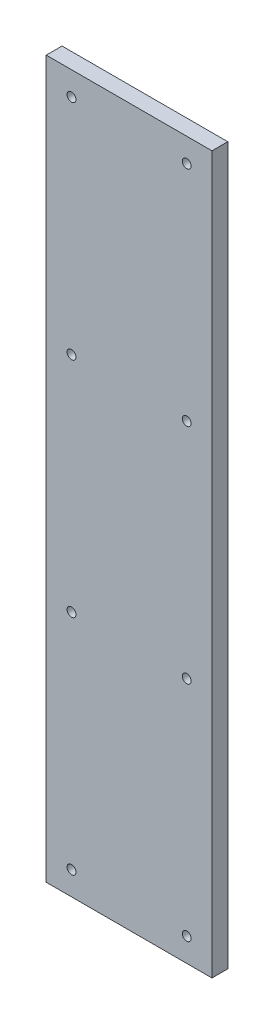
ISO-10303-21;
HEADER;
FILE_DESCRIPTION(('STEP AP214'),'2;1');
FILE_NAME('part.step','',(''),(''),'','','');
FILE_SCHEMA(('AUTOMOTIVE_DESIGN { 1 0 10303 214 1 1 1 1 }'));
ENDSEC;
DATA;
#1=APPLICATION_CONTEXT('core data for automotive mechanical design processes');
#2=APPLICATION_PROTOCOL_DEFINITION('international standard','automotive_design',2000,#1);
#3=PRODUCT_CONTEXT('',#1,'mechanical');
#4=PRODUCT('Part','Part','',(#3));
#5=PRODUCT_RELATED_PRODUCT_CATEGORY('part','',(#4));
#6=PRODUCT_DEFINITION_FORMATION('','',#4);
#7=PRODUCT_DEFINITION_CONTEXT('part definition',#1,'design');
#8=PRODUCT_DEFINITION('design','',#6,#7);
#9=PRODUCT_DEFINITION_SHAPE('','',#8);
#10=(LENGTH_UNIT() NAMED_UNIT(*) SI_UNIT(.MILLI.,.METRE.));
#11=(NAMED_UNIT(*) PLANE_ANGLE_UNIT() SI_UNIT($,.RADIAN.));
#12=(NAMED_UNIT(*) SI_UNIT($,.STERADIAN.) SOLID_ANGLE_UNIT());
#13=UNCERTAINTY_MEASURE_WITH_UNIT(LENGTH_MEASURE(1.E-05),#10,'distance_accuracy_value','');
#14=(GEOMETRIC_REPRESENTATION_CONTEXT(3) GLOBAL_UNCERTAINTY_ASSIGNED_CONTEXT((#13)) GLOBAL_UNIT_ASSIGNED_CONTEXT((#10,
#11,#12)) REPRESENTATION_CONTEXT('',''));
#15=CARTESIAN_POINT('',(0.,0.,0.));
#16=DIRECTION('',(0.,0.,1.));
#17=DIRECTION('',(1.,0.,0.));
#18=AXIS2_PLACEMENT_3D('',#15,#16,#17);
#19=CARTESIAN_POINT('',(0.,0.,6.35));
#20=DIRECTION('',(0.,0.,1.));
#21=DIRECTION('',(1.,0.,0.));
#22=AXIS2_PLACEMENT_3D('',#19,#20,#21);
#23=PLANE('',#22);
#24=CARTESIAN_POINT('',(10.175,-189.018333333333,6.35));
#25=DIRECTION('',(0.,0.,1.));
#26=DIRECTION('',(1.,0.,0.));
#27=AXIS2_PLACEMENT_3D('',#24,#25,#26);
#28=CIRCLE('',#27,1.7859375);
#29=CARTESIAN_POINT('',(11.9609375,-189.018333333333,6.35));
#30=VERTEX_POINT('',#29);
#31=EDGE_CURVE('E174',#30,#30,#28,.T.);
#32=ORIENTED_EDGE('',*,*,#31,.F.);
#33=EDGE_LOOP('',(#32));
#34=FACE_BOUND('',#33,.T.);
#35=CARTESIAN_POINT('',(10.175,-278.765,6.35));
#36=DIRECTION('',(0.,0.,1.));
#37=DIRECTION('',(1.,0.,0.));
#38=AXIS2_PLACEMENT_3D('',#35,#36,#37);
#39=CIRCLE('',#38,1.78593749999999);
#40=CARTESIAN_POINT('',(11.9609375,-278.765,6.35));
#41=VERTEX_POINT('',#40);
#42=EDGE_CURVE('E158',#41,#41,#39,.T.);
#43=ORIENTED_EDGE('',*,*,#42,.F.);
#44=EDGE_LOOP('',(#43));
#45=FACE_BOUND('',#44,.T.);
#46=CARTESIAN_POINT('',(56.525,-99.2716666666667,6.35));
#47=DIRECTION('',(0.,0.,1.));
#48=DIRECTION('',(1.,0.,0.));
#49=AXIS2_PLACEMENT_3D('',#46,#47,#48);
#50=CIRCLE('',#49,1.78593750000001);
#51=CARTESIAN_POINT('',(58.3109375,-99.2716666666667,6.35));
#52=VERTEX_POINT('',#51);
#53=EDGE_CURVE('E142',#52,#52,#50,.T.);
#54=ORIENTED_EDGE('',*,*,#53,.F.);
#55=EDGE_LOOP('',(#54));
#56=FACE_BOUND('',#55,.T.);
#57=CARTESIAN_POINT('',(10.175,-9.52500000000001,6.35));
#58=DIRECTION('',(0.,0.,1.));
#59=DIRECTION('',(1.,0.,0.));
#60=AXIS2_PLACEMENT_3D('',#57,#58,#59);
#61=CIRCLE('',#60,1.7859375);
#62=CARTESIAN_POINT('',(11.9609375,-9.52500000000001,6.35));
#63=VERTEX_POINT('',#62);
#64=EDGE_CURVE('E112',#63,#63,#61,.T.);
#65=ORIENTED_EDGE('',*,*,#64,.F.);
#66=EDGE_LOOP('',(#65));
#67=FACE_BOUND('',#66,.T.);
#68=DIRECTION('',(0.,-1.,0.));
#69=VECTOR('',#68,1.);
#70=CARTESIAN_POINT('',(0.,0.,6.35));
#71=LINE('',#70,#69);
#72=CARTESIAN_POINT('',(0.,0.,6.35));
#73=VERTEX_POINT('',#72);
#74=CARTESIAN_POINT('',(0.,-288.29,6.35));
#75=VERTEX_POINT('',#74);
#76=EDGE_CURVE('E92',#73,#75,#71,.T.);
#77=ORIENTED_EDGE('',*,*,#76,.T.);
#78=DIRECTION('',(1.,0.,0.));
#79=VECTOR('',#78,1.);
#80=CARTESIAN_POINT('',(0.,-288.29,6.35));
#81=LINE('',#80,#79);
#82=CARTESIAN_POINT('',(66.7,-288.29,6.35));
#83=VERTEX_POINT('',#82);
#84=EDGE_CURVE('E87',#75,#83,#81,.T.);
#85=ORIENTED_EDGE('',*,*,#84,.T.);
#86=DIRECTION('',(0.,1.,0.));
#87=VECTOR('',#86,1.);
#88=CARTESIAN_POINT('',(66.7,-288.29,6.35));
#89=LINE('',#88,#87);
#90=CARTESIAN_POINT('',(66.7,0.,6.35));
#91=VERTEX_POINT('',#90);
#92=EDGE_CURVE('E90',#83,#91,#89,.T.);
#93=ORIENTED_EDGE('',*,*,#92,.T.);
#94=DIRECTION('',(-1.,0.,0.));
#95=VECTOR('',#94,1.);
#96=CARTESIAN_POINT('',(66.7,0.,6.35));
#97=LINE('',#96,#95);
#98=EDGE_CURVE('E57',#91,#73,#97,.T.);
#99=ORIENTED_EDGE('',*,*,#98,.T.);
#100=EDGE_LOOP('',(#77,#85,#93,#99));
#101=FACE_BOUND('',#100,.T.);
#102=CARTESIAN_POINT('',(56.5249999999999,-9.52500000000001,6.35));
#103=DIRECTION('',(0.,0.,1.));
#104=DIRECTION('',(1.,0.,0.));
#105=AXIS2_PLACEMENT_3D('',#102,#103,#104);
#106=CIRCLE('',#105,1.7859375);
#107=CARTESIAN_POINT('',(58.3109375,-9.52500000000001,6.35));
#108=VERTEX_POINT('',#107);
#109=EDGE_CURVE('E134',#108,#108,#106,.T.);
#110=ORIENTED_EDGE('',*,*,#109,.F.);
#111=EDGE_LOOP('',(#110));
#112=FACE_BOUND('',#111,.T.);
#113=CARTESIAN_POINT('',(10.175,-99.2716666666667,6.35));
#114=DIRECTION('',(0.,0.,1.));
#115=DIRECTION('',(1.,0.,0.));
#116=AXIS2_PLACEMENT_3D('',#113,#114,#115);
#117=CIRCLE('',#116,1.7859375);
#118=CARTESIAN_POINT('',(11.9609375,-99.2716666666667,6.35));
#119=VERTEX_POINT('',#118);
#120=EDGE_CURVE('E150',#119,#119,#117,.T.);
#121=ORIENTED_EDGE('',*,*,#120,.F.);
#122=EDGE_LOOP('',(#121));
#123=FACE_BOUND('',#122,.T.);
#124=CARTESIAN_POINT('',(56.525,-278.765,6.35));
#125=DIRECTION('',(0.,0.,1.));
#126=DIRECTION('',(1.,0.,0.));
#127=AXIS2_PLACEMENT_3D('',#124,#125,#126);
#128=CIRCLE('',#127,1.78593749999999);
#129=CARTESIAN_POINT('',(58.3109375,-278.765,6.35));
#130=VERTEX_POINT('',#129);
#131=EDGE_CURVE('E166',#130,#130,#128,.T.);
#132=ORIENTED_EDGE('',*,*,#131,.F.);
#133=EDGE_LOOP('',(#132));
#134=FACE_BOUND('',#133,.T.);
#135=CARTESIAN_POINT('',(56.525,-189.018333333333,6.35));
#136=DIRECTION('',(0.,0.,1.));
#137=DIRECTION('',(1.,0.,0.));
#138=AXIS2_PLACEMENT_3D('',#135,#136,#137);
#139=CIRCLE('',#138,1.78593750000001);
#140=CARTESIAN_POINT('',(58.3109375,-189.018333333333,6.35));
#141=VERTEX_POINT('',#140);
#142=EDGE_CURVE('E182',#141,#141,#139,.T.);
#143=ORIENTED_EDGE('',*,*,#142,.F.);
#144=EDGE_LOOP('',(#143));
#145=FACE_BOUND('',#144,.T.);
#146=ADVANCED_FACE('F39',(#34,#45,#56,#67,#101,#112,#123,#134,#145),#23,.T.);
#147=CARTESIAN_POINT('',(0.,0.,0.));
#148=DIRECTION('',(0.,0.,1.));
#149=DIRECTION('',(1.,0.,0.));
#150=AXIS2_PLACEMENT_3D('',#147,#148,#149);
#151=PLANE('',#150);
#152=DIRECTION('',(0.,-1.,0.));
#153=VECTOR('',#152,1.);
#154=CARTESIAN_POINT('',(0.,0.,0.));
#155=LINE('',#154,#153);
#156=CARTESIAN_POINT('',(0.,0.,0.));
#157=VERTEX_POINT('',#156);
#158=CARTESIAN_POINT('',(0.,-288.29,0.));
#159=VERTEX_POINT('',#158);
#160=EDGE_CURVE('E108',#157,#159,#155,.T.);
#161=ORIENTED_EDGE('',*,*,#160,.F.);
#162=DIRECTION('',(-1.,0.,0.));
#163=VECTOR('',#162,1.);
#164=CARTESIAN_POINT('',(66.7,0.,0.));
#165=LINE('',#164,#163);
#166=CARTESIAN_POINT('',(66.7,0.,0.));
#167=VERTEX_POINT('',#166);
#168=EDGE_CURVE('E80',#167,#157,#165,.T.);
#169=ORIENTED_EDGE('',*,*,#168,.F.);
#170=DIRECTION('',(0.,1.,0.));
#171=VECTOR('',#170,1.);
#172=CARTESIAN_POINT('',(66.7,-288.29,0.));
#173=LINE('',#172,#171);
#174=CARTESIAN_POINT('',(66.7,-288.29,0.));
#175=VERTEX_POINT('',#174);
#176=EDGE_CURVE('E74',#175,#167,#173,.T.);
#177=ORIENTED_EDGE('',*,*,#176,.F.);
#178=DIRECTION('',(1.,0.,0.));
#179=VECTOR('',#178,1.);
#180=CARTESIAN_POINT('',(0.,-288.29,0.));
#181=LINE('',#180,#179);
#182=EDGE_CURVE('E97',#159,#175,#181,.T.);
#183=ORIENTED_EDGE('',*,*,#182,.F.);
#184=EDGE_LOOP('',(#161,#169,#177,#183));
#185=FACE_BOUND('',#184,.T.);
#186=CARTESIAN_POINT('',(10.175,-9.52500000000001,0.));
#187=DIRECTION('',(0.,0.,1.));
#188=DIRECTION('',(1.,0.,0.));
#189=AXIS2_PLACEMENT_3D('',#186,#187,#188);
#190=CIRCLE('',#189,1.7859375);
#191=CARTESIAN_POINT('',(11.9609375,-9.52500000000001,0.));
#192=VERTEX_POINT('',#191);
#193=EDGE_CURVE('E130',#192,#192,#190,.T.);
#194=ORIENTED_EDGE('',*,*,#193,.T.);
#195=EDGE_LOOP('',(#194));
#196=FACE_BOUND('',#195,.T.);
#197=CARTESIAN_POINT('',(56.5249999999999,-9.52500000000001,0.));
#198=DIRECTION('',(0.,0.,1.));
#199=DIRECTION('',(1.,0.,0.));
#200=AXIS2_PLACEMENT_3D('',#197,#198,#199);
#201=CIRCLE('',#200,1.7859375);
#202=CARTESIAN_POINT('',(58.3109375,-9.52500000000001,0.));
#203=VERTEX_POINT('',#202);
#204=EDGE_CURVE('E138',#203,#203,#201,.T.);
#205=ORIENTED_EDGE('',*,*,#204,.T.);
#206=EDGE_LOOP('',(#205));
#207=FACE_BOUND('',#206,.T.);
#208=CARTESIAN_POINT('',(56.525,-99.2716666666667,0.));
#209=DIRECTION('',(0.,0.,1.));
#210=DIRECTION('',(1.,0.,0.));
#211=AXIS2_PLACEMENT_3D('',#208,#209,#210);
#212=CIRCLE('',#211,1.78593750000001);
#213=CARTESIAN_POINT('',(58.3109375,-99.2716666666667,0.));
#214=VERTEX_POINT('',#213);
#215=EDGE_CURVE('E146',#214,#214,#212,.T.);
#216=ORIENTED_EDGE('',*,*,#215,.T.);
#217=EDGE_LOOP('',(#216));
#218=FACE_BOUND('',#217,.T.);
#219=CARTESIAN_POINT('',(10.175,-99.2716666666667,0.));
#220=DIRECTION('',(0.,0.,1.));
#221=DIRECTION('',(1.,0.,0.));
#222=AXIS2_PLACEMENT_3D('',#219,#220,#221);
#223=CIRCLE('',#222,1.7859375);
#224=CARTESIAN_POINT('',(11.9609375,-99.2716666666667,0.));
#225=VERTEX_POINT('',#224);
#226=EDGE_CURVE('E154',#225,#225,#223,.T.);
#227=ORIENTED_EDGE('',*,*,#226,.T.);
#228=EDGE_LOOP('',(#227));
#229=FACE_BOUND('',#228,.T.);
#230=CARTESIAN_POINT('',(10.175,-278.765,0.));
#231=DIRECTION('',(0.,0.,1.));
#232=DIRECTION('',(1.,0.,0.));
#233=AXIS2_PLACEMENT_3D('',#230,#231,#232);
#234=CIRCLE('',#233,1.78593749999999);
#235=CARTESIAN_POINT('',(11.9609375,-278.765,0.));
#236=VERTEX_POINT('',#235);
#237=EDGE_CURVE('E162',#236,#236,#234,.T.);
#238=ORIENTED_EDGE('',*,*,#237,.T.);
#239=EDGE_LOOP('',(#238));
#240=FACE_BOUND('',#239,.T.);
#241=CARTESIAN_POINT('',(56.525,-278.765,0.));
#242=DIRECTION('',(0.,0.,1.));
#243=DIRECTION('',(1.,0.,0.));
#244=AXIS2_PLACEMENT_3D('',#241,#242,#243);
#245=CIRCLE('',#244,1.78593749999999);
#246=CARTESIAN_POINT('',(58.3109375,-278.765,0.));
#247=VERTEX_POINT('',#246);
#248=EDGE_CURVE('E170',#247,#247,#245,.T.);
#249=ORIENTED_EDGE('',*,*,#248,.T.);
#250=EDGE_LOOP('',(#249));
#251=FACE_BOUND('',#250,.T.);
#252=CARTESIAN_POINT('',(10.175,-189.018333333333,0.));
#253=DIRECTION('',(0.,0.,1.));
#254=DIRECTION('',(1.,0.,0.));
#255=AXIS2_PLACEMENT_3D('',#252,#253,#254);
#256=CIRCLE('',#255,1.7859375);
#257=CARTESIAN_POINT('',(11.9609375,-189.018333333333,0.));
#258=VERTEX_POINT('',#257);
#259=EDGE_CURVE('E178',#258,#258,#256,.T.);
#260=ORIENTED_EDGE('',*,*,#259,.T.);
#261=EDGE_LOOP('',(#260));
#262=FACE_BOUND('',#261,.T.);
#263=CARTESIAN_POINT('',(56.525,-189.018333333333,0.));
#264=DIRECTION('',(0.,0.,1.));
#265=DIRECTION('',(1.,0.,0.));
#266=AXIS2_PLACEMENT_3D('',#263,#264,#265);
#267=CIRCLE('',#266,1.78593750000001);
#268=CARTESIAN_POINT('',(58.3109375,-189.018333333333,0.));
#269=VERTEX_POINT('',#268);
#270=EDGE_CURVE('E186',#269,#269,#267,.T.);
#271=ORIENTED_EDGE('',*,*,#270,.T.);
#272=EDGE_LOOP('',(#271));
#273=FACE_BOUND('',#272,.T.);
#274=ADVANCED_FACE('F125',(#185,#196,#207,#218,#229,#240,#251,#262,#273),#151,.F.);
#275=CARTESIAN_POINT('',(0.,0.,6.35));
#276=DIRECTION('',(1.,0.,0.));
#277=DIRECTION('',(0.,0.,-1.));
#278=AXIS2_PLACEMENT_3D('',#275,#276,#277);
#279=PLANE('',#278);
#280=ORIENTED_EDGE('',*,*,#160,.T.);
#281=DIRECTION('',(0.,0.,-1.));
#282=VECTOR('',#281,1.);
#283=CARTESIAN_POINT('',(0.,-288.29,6.35));
#284=LINE('',#283,#282);
#285=EDGE_CURVE('E11',#75,#159,#284,.T.);
#286=ORIENTED_EDGE('',*,*,#285,.F.);
#287=ORIENTED_EDGE('',*,*,#76,.F.);
#288=DIRECTION('',(0.,0.,-1.));
#289=VECTOR('',#288,1.);
#290=CARTESIAN_POINT('',(0.,0.,6.35));
#291=LINE('',#290,#289);
#292=EDGE_CURVE('E104',#73,#157,#291,.T.);
#293=ORIENTED_EDGE('',*,*,#292,.T.);
#294=EDGE_LOOP('',(#280,#286,#287,#293));
#295=FACE_BOUND('',#294,.T.);
#296=ADVANCED_FACE('F41',(#295),#279,.F.);
#297=CARTESIAN_POINT('',(0.,-288.29,6.35));
#298=DIRECTION('',(0.,1.,0.));
#299=DIRECTION('',(0.,0.,1.));
#300=AXIS2_PLACEMENT_3D('',#297,#298,#299);
#301=PLANE('',#300);
#302=ORIENTED_EDGE('',*,*,#182,.T.);
#303=DIRECTION('',(0.,0.,-1.));
#304=VECTOR('',#303,1.);
#305=CARTESIAN_POINT('',(66.7,-288.29,6.35));
#306=LINE('',#305,#304);
#307=EDGE_CURVE('E49',#83,#175,#306,.T.);
#308=ORIENTED_EDGE('',*,*,#307,.F.);
#309=ORIENTED_EDGE('',*,*,#84,.F.);
#310=ORIENTED_EDGE('',*,*,#285,.T.);
#311=EDGE_LOOP('',(#302,#308,#309,#310));
#312=FACE_BOUND('',#311,.T.);
#313=ADVANCED_FACE('F96',(#312),#301,.F.);
#314=CARTESIAN_POINT('',(66.7,-288.29,6.35));
#315=DIRECTION('',(-1.,0.,0.));
#316=DIRECTION('',(0.,0.,1.));
#317=AXIS2_PLACEMENT_3D('',#314,#315,#316);
#318=PLANE('',#317);
#319=ORIENTED_EDGE('',*,*,#176,.T.);
#320=DIRECTION('',(0.,0.,-1.));
#321=VECTOR('',#320,1.);
#322=CARTESIAN_POINT('',(66.7,0.,6.35));
#323=LINE('',#322,#321);
#324=EDGE_CURVE('E99',#91,#167,#323,.T.);
#325=ORIENTED_EDGE('',*,*,#324,.F.);
#326=ORIENTED_EDGE('',*,*,#92,.F.);
#327=ORIENTED_EDGE('',*,*,#307,.T.);
#328=EDGE_LOOP('',(#319,#325,#326,#327));
#329=FACE_BOUND('',#328,.T.);
#330=ADVANCED_FACE('F100',(#329),#318,.F.);
#331=CARTESIAN_POINT('',(66.7,0.,6.35));
#332=DIRECTION('',(0.,-1.,0.));
#333=DIRECTION('',(0.,0.,-1.));
#334=AXIS2_PLACEMENT_3D('',#331,#332,#333);
#335=PLANE('',#334);
#336=ORIENTED_EDGE('',*,*,#168,.T.);
#337=ORIENTED_EDGE('',*,*,#292,.F.);
#338=ORIENTED_EDGE('',*,*,#98,.F.);
#339=ORIENTED_EDGE('',*,*,#324,.T.);
#340=EDGE_LOOP('',(#336,#337,#338,#339));
#341=FACE_BOUND('',#340,.T.);
#342=ADVANCED_FACE('F122',(#341),#335,.F.);
#343=CARTESIAN_POINT('',(10.175,-9.52500000000001,6.35));
#344=DIRECTION('',(0.,0.,-1.));
#345=DIRECTION('',(-1.,0.,0.));
#346=AXIS2_PLACEMENT_3D('',#343,#344,#345);
#347=CYLINDRICAL_SURFACE('',#346,1.7859375);
#348=ORIENTED_EDGE('',*,*,#64,.T.);
#349=EDGE_LOOP('',(#348));
#350=FACE_BOUND('',#349,.T.);
#351=ORIENTED_EDGE('',*,*,#193,.F.);
#352=EDGE_LOOP('',(#351));
#353=FACE_BOUND('',#352,.T.);
#354=ADVANCED_FACE('F207',(#350,#353),#347,.F.);
#355=CARTESIAN_POINT('',(56.5249999999999,-9.52500000000001,6.35));
#356=DIRECTION('',(0.,0.,-1.));
#357=DIRECTION('',(-1.,0.,0.));
#358=AXIS2_PLACEMENT_3D('',#355,#356,#357);
#359=CYLINDRICAL_SURFACE('',#358,1.7859375);
#360=ORIENTED_EDGE('',*,*,#109,.T.);
#361=EDGE_LOOP('',(#360));
#362=FACE_BOUND('',#361,.T.);
#363=ORIENTED_EDGE('',*,*,#204,.F.);
#364=EDGE_LOOP('',(#363));
#365=FACE_BOUND('',#364,.T.);
#366=ADVANCED_FACE('F253',(#362,#365),#359,.F.);
#367=CARTESIAN_POINT('',(56.525,-99.2716666666667,6.35));
#368=DIRECTION('',(0.,0.,-1.));
#369=DIRECTION('',(-1.,0.,0.));
#370=AXIS2_PLACEMENT_3D('',#367,#368,#369);
#371=CYLINDRICAL_SURFACE('',#370,1.78593750000001);
#372=ORIENTED_EDGE('',*,*,#53,.T.);
#373=EDGE_LOOP('',(#372));
#374=FACE_BOUND('',#373,.T.);
#375=ORIENTED_EDGE('',*,*,#215,.F.);
#376=EDGE_LOOP('',(#375));
#377=FACE_BOUND('',#376,.T.);
#378=ADVANCED_FACE('F261',(#374,#377),#371,.F.);
#379=CARTESIAN_POINT('',(10.175,-99.2716666666667,6.35));
#380=DIRECTION('',(0.,0.,-1.));
#381=DIRECTION('',(-1.,0.,0.));
#382=AXIS2_PLACEMENT_3D('',#379,#380,#381);
#383=CYLINDRICAL_SURFACE('',#382,1.7859375);
#384=ORIENTED_EDGE('',*,*,#120,.T.);
#385=EDGE_LOOP('',(#384));
#386=FACE_BOUND('',#385,.T.);
#387=ORIENTED_EDGE('',*,*,#226,.F.);
#388=EDGE_LOOP('',(#387));
#389=FACE_BOUND('',#388,.T.);
#390=ADVANCED_FACE('F269',(#386,#389),#383,.F.);
#391=CARTESIAN_POINT('',(10.175,-278.765,6.35));
#392=DIRECTION('',(0.,0.,-1.));
#393=DIRECTION('',(-1.,0.,0.));
#394=AXIS2_PLACEMENT_3D('',#391,#392,#393);
#395=CYLINDRICAL_SURFACE('',#394,1.78593749999999);
#396=ORIENTED_EDGE('',*,*,#42,.T.);
#397=EDGE_LOOP('',(#396));
#398=FACE_BOUND('',#397,.T.);
#399=ORIENTED_EDGE('',*,*,#237,.F.);
#400=EDGE_LOOP('',(#399));
#401=FACE_BOUND('',#400,.T.);
#402=ADVANCED_FACE('F278',(#398,#401),#395,.F.);
#403=CARTESIAN_POINT('',(56.525,-278.765,6.35));
#404=DIRECTION('',(0.,0.,-1.));
#405=DIRECTION('',(-1.,0.,0.));
#406=AXIS2_PLACEMENT_3D('',#403,#404,#405);
#407=CYLINDRICAL_SURFACE('',#406,1.78593749999999);
#408=ORIENTED_EDGE('',*,*,#131,.T.);
#409=EDGE_LOOP('',(#408));
#410=FACE_BOUND('',#409,.T.);
#411=ORIENTED_EDGE('',*,*,#248,.F.);
#412=EDGE_LOOP('',(#411));
#413=FACE_BOUND('',#412,.T.);
#414=ADVANCED_FACE('F287',(#410,#413),#407,.F.);
#415=CARTESIAN_POINT('',(10.175,-189.018333333333,6.35));
#416=DIRECTION('',(0.,0.,-1.));
#417=DIRECTION('',(-1.,0.,0.));
#418=AXIS2_PLACEMENT_3D('',#415,#416,#417);
#419=CYLINDRICAL_SURFACE('',#418,1.7859375);
#420=ORIENTED_EDGE('',*,*,#31,.T.);
#421=EDGE_LOOP('',(#420));
#422=FACE_BOUND('',#421,.T.);
#423=ORIENTED_EDGE('',*,*,#259,.F.);
#424=EDGE_LOOP('',(#423));
#425=FACE_BOUND('',#424,.T.);
#426=ADVANCED_FACE('F296',(#422,#425),#419,.F.);
#427=CARTESIAN_POINT('',(56.525,-189.018333333333,6.35));
#428=DIRECTION('',(0.,0.,-1.));
#429=DIRECTION('',(-1.,0.,0.));
#430=AXIS2_PLACEMENT_3D('',#427,#428,#429);
#431=CYLINDRICAL_SURFACE('',#430,1.78593750000001);
#432=ORIENTED_EDGE('',*,*,#142,.T.);
#433=EDGE_LOOP('',(#432));
#434=FACE_BOUND('',#433,.T.);
#435=ORIENTED_EDGE('',*,*,#270,.F.);
#436=EDGE_LOOP('',(#435));
#437=FACE_BOUND('',#436,.T.);
#438=ADVANCED_FACE('F194',(#434,#437),#431,.F.);
#439=CLOSED_SHELL('',(#146,#274,#296,#313,#330,#342,#354,#366,#378,#390,#402,#414,#426,#438));
#440=MANIFOLD_SOLID_BREP('B2',#439);
#441=ADVANCED_BREP_SHAPE_REPRESENTATION('',(#18,#440),#14);
#442=SHAPE_DEFINITION_REPRESENTATION(#9,#441);
ENDSEC;
END-ISO-10303-21;
